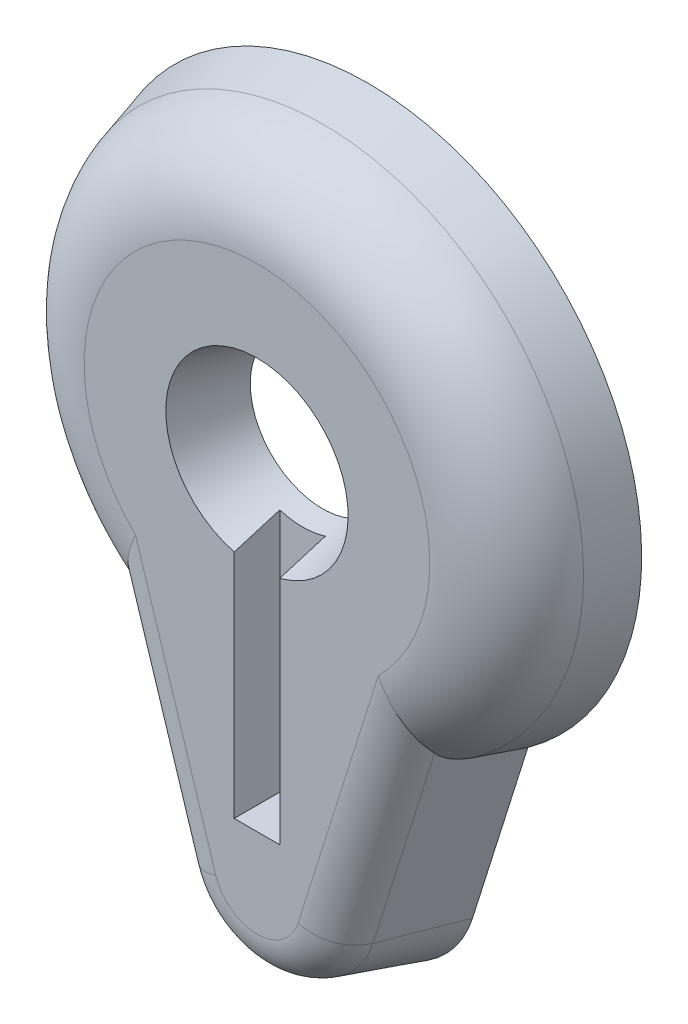
ISO-10303-21;
HEADER;
FILE_DESCRIPTION(('STEP AP214'),'2;1');
FILE_NAME('part.step','',(''),(''),'','','');
FILE_SCHEMA(('AUTOMOTIVE_DESIGN { 1 0 10303 214 1 1 1 1 }'));
ENDSEC;
DATA;
#1=APPLICATION_CONTEXT('core data for automotive mechanical design processes');
#2=APPLICATION_PROTOCOL_DEFINITION('international standard','automotive_design',2000,#1);
#3=PRODUCT_CONTEXT('',#1,'mechanical');
#4=PRODUCT('Part','Part','',(#3));
#5=PRODUCT_RELATED_PRODUCT_CATEGORY('part','',(#4));
#6=PRODUCT_DEFINITION_FORMATION('','',#4);
#7=PRODUCT_DEFINITION_CONTEXT('part definition',#1,'design');
#8=PRODUCT_DEFINITION('design','',#6,#7);
#9=PRODUCT_DEFINITION_SHAPE('','',#8);
#10=(LENGTH_UNIT() NAMED_UNIT(*) SI_UNIT(.MILLI.,.METRE.));
#11=(NAMED_UNIT(*) PLANE_ANGLE_UNIT() SI_UNIT($,.RADIAN.));
#12=(NAMED_UNIT(*) SI_UNIT($,.STERADIAN.) SOLID_ANGLE_UNIT());
#13=UNCERTAINTY_MEASURE_WITH_UNIT(LENGTH_MEASURE(1.E-05),#10,'distance_accuracy_value','');
#14=(GEOMETRIC_REPRESENTATION_CONTEXT(3) GLOBAL_UNCERTAINTY_ASSIGNED_CONTEXT((#13)) GLOBAL_UNIT_ASSIGNED_CONTEXT((#10,
#11,#12)) REPRESENTATION_CONTEXT('',''));
#15=CARTESIAN_POINT('',(0.,0.,0.));
#16=DIRECTION('',(0.,0.,1.));
#17=DIRECTION('',(1.,0.,0.));
#18=AXIS2_PLACEMENT_3D('',#15,#16,#17);
#19=CARTESIAN_POINT('',(0.,0.,0.));
#20=DIRECTION('',(0.,0.,-1.));
#21=DIRECTION('',(1.,0.,0.));
#22=AXIS2_PLACEMENT_3D('',#19,#20,#21);
#23=CONICAL_SURFACE('',#22,15.24,0.279252680319093);
#24=DIRECTION('',(0.262880018502093,-0.082885751454195,-0.961261695938319));
#25=VECTOR('',#24,1.);
#26=CARTESIAN_POINT('',(14.534646329403,-4.58275638444513,0.));
#27=LINE('',#26,#25);
#28=CARTESIAN_POINT('',(11.5553400030557,-3.64338470804834,10.8942972094379));
#29=VERTEX_POINT('',#28);
#30=CARTESIAN_POINT('',(14.534646329403,-4.58275638444513,0.));
#31=VERTEX_POINT('',#30);
#32=EDGE_CURVE('E285',#29,#31,#27,.T.);
#33=ORIENTED_EDGE('',*,*,#32,.F.);
#34=CARTESIAN_POINT('',(0.,0.,10.8942972094379));
#35=DIRECTION('',(0.,0.,-1.));
#36=DIRECTION('',(-1.,0.,0.));
#37=AXIS2_PLACEMENT_3D('',#34,#35,#36);
#38=CIRCLE('',#37,12.1161105441086);
#39=CARTESIAN_POINT('',(-11.5553400030557,-3.64338470804834,10.8942972094379));
#40=VERTEX_POINT('',#39);
#41=EDGE_CURVE('E356',#29,#40,#38,.T.);
#42=ORIENTED_EDGE('',*,*,#41,.T.);
#43=DIRECTION('',(-0.262880018502093,-0.0828857514541949,-0.961261695938319));
#44=VECTOR('',#43,1.);
#45=CARTESIAN_POINT('',(-14.534646329403,-4.58275638444513,0.));
#46=LINE('',#45,#44);
#47=CARTESIAN_POINT('',(-14.534646329403,-4.58275638444513,0.));
#48=VERTEX_POINT('',#47);
#49=EDGE_CURVE('E379',#40,#48,#46,.T.);
#50=ORIENTED_EDGE('',*,*,#49,.T.);
#51=CARTESIAN_POINT('',(0.,0.,0.));
#52=DIRECTION('',(0.,0.,1.));
#53=DIRECTION('',(1.,0.,0.));
#54=AXIS2_PLACEMENT_3D('',#51,#52,#53);
#55=CIRCLE('',#54,15.24);
#56=EDGE_CURVE('E350',#48,#31,#55,.T.);
#57=ORIENTED_EDGE('',*,*,#56,.T.);
#58=EDGE_LOOP('',(#33,#42,#50,#57));
#59=FACE_BOUND('',#58,.T.);
#60=ADVANCED_FACE('F40',(#59),#23,.T.);
#61=CARTESIAN_POINT('',(14.534646329403,-4.58275638444513,0.));
#62=DIRECTION('',(0.916771573521362,-0.289056966809967,0.275637355817));
#63=DIRECTION('',(0.300705799504274,0.953716950748227,0.));
#64=AXIS2_PLACEMENT_3D('',#61,#62,#63);
#65=PLANE('',#64);
#66=CARTESIAN_POINT('',(18.4661043795052,22.6609190085483,15.494));
#67=CARTESIAN_POINT('',(18.7794331227108,22.4238435658306,14.2032489976163));
#68=CARTESIAN_POINT('',(19.0931570385685,22.1879126815013,12.9123839305844));
#69=CARTESIAN_POINT('',(19.7213544121076,21.7182279454823,10.3304438388195));
#70=CARTESIAN_POINT('',(20.0358278677993,21.484474088022,9.03936881465236));
#71=CARTESIAN_POINT('',(20.6654850546608,21.0190301578938,6.45702064732496));
#72=CARTESIAN_POINT('',(20.9806687855488,20.7873400844076,5.1657475042435));
#73=CARTESIAN_POINT('',(21.6117124177187,20.3259238523854,2.58301180073138));
#74=CARTESIAN_POINT('',(21.9275723207909,20.0961976990575,1.29154923980762));
#75=CARTESIAN_POINT('',(22.2437523595632,19.8674042316777,0.));
#76=B_SPLINE_CURVE_WITH_KNOTS('',3,(#66,#67,#68,#69,#70,#71,#72,#73,#74,#75),.UNSPECIFIED.,.F.,
.F.,(4,2,2,2,4),(0.,4.04768493479465,8.09535913744307,12.1430317352329,16.1907150637494),.UNSPECIFIED.);
#77=CARTESIAN_POINT('',(20.7052286654907,20.9901952760398,6.29459441887579));
#78=VERTEX_POINT('',#77);
#79=CARTESIAN_POINT('',(22.2437523595632,19.8674042316777,0.));
#80=VERTEX_POINT('',#79);
#81=EDGE_CURVE('E278',#78,#80,#76,.T.);
#82=ORIENTED_EDGE('',*,*,#81,.F.);
#83=CARTESIAN_POINT('',(20.7052286654917,20.9901952760405,6.29459441887589));
#84=CARTESIAN_POINT('',(20.6522578061883,21.0291060956109,6.51158105095914));
#85=CARTESIAN_POINT('',(20.6026423920615,21.0777707275308,6.72763613535384));
#86=CARTESIAN_POINT('',(20.5104988651825,21.194062310094,7.15605940874421));
#87=CARTESIAN_POINT('',(20.467968840799,21.261684132854,7.36842857829913));
#88=CARTESIAN_POINT('',(20.3914403984128,21.4131947263882,7.78184965765318));
#89=CARTESIAN_POINT('',(20.3572348318264,21.4965697523686,7.98305178809662));
#90=CARTESIAN_POINT('',(20.2960098800669,21.6798445845403,8.37888406605506));
#91=CARTESIAN_POINT('',(20.2689898707987,21.7797429543883,8.5735147830415));
#92=CARTESIAN_POINT('',(20.2217827719205,21.9967438261983,8.95809161155702));
#93=CARTESIAN_POINT('',(20.2017158420014,22.1141031075996,9.14790735213916));
#94=CARTESIAN_POINT('',(20.1689334973503,22.3634378812403,9.51841545970538));
#95=CARTESIAN_POINT('',(20.1562204076856,22.4954179804531,9.6991049247683));
#96=CARTESIAN_POINT('',(20.1376634128668,22.7766255594111,10.0557239863107));
#97=CARTESIAN_POINT('',(20.132035856095,22.9262502462302,10.2313505521116));
#98=CARTESIAN_POINT('',(20.1279900556686,23.2376304085976,10.5713468483465));
#99=CARTESIAN_POINT('',(20.129566063429,23.3993761099778,10.7357254485794));
#100=CARTESIAN_POINT('',(20.1345570886339,23.566415608917,10.8942972094379));
#101=B_SPLINE_CURVE_WITH_KNOTS('',3,(#83,#84,#85,#86,#87,#88,#89,#90,#91,#92,#93,#94,#95,#96,
#97,#98,#99,#100),.UNSPECIFIED.,.F.,.F.,(4,2,2,2,2,2,2,2,4),(0.,0.679935593326594,
1.35968744255824,2.02022828000799,2.68071172802758,3.3520983103277,4.02369704939871,
4.71534086046438,5.40643282268094),.UNSPECIFIED.);
#102=CARTESIAN_POINT('',(20.1345570886339,23.566415608917,10.8942972094379));
#103=VERTEX_POINT('',#102);
#104=EDGE_CURVE('E295',#78,#103,#101,.T.);
#105=ORIENTED_EDGE('',*,*,#104,.T.);
#106=DIRECTION('',(0.300705799504274,0.953716950748227,0.));
#107=VECTOR('',#106,1.);
#108=CARTESIAN_POINT('',(11.5553400030557,-3.64338470804834,10.8942972094379));
#109=LINE('',#108,#107);
#110=EDGE_CURVE('E359',#103,#29,#109,.F.);
#111=ORIENTED_EDGE('',*,*,#110,.T.);
#112=ORIENTED_EDGE('',*,*,#32,.T.);
#113=DIRECTION('',(0.300705799504274,0.953716950748227,0.));
#114=VECTOR('',#113,1.);
#115=CARTESIAN_POINT('',(14.534646329403,-4.58275638444513,0.));
#116=LINE('',#115,#114);
#117=EDGE_CURVE('E393',#31,#80,#116,.T.);
#118=ORIENTED_EDGE('',*,*,#117,.T.);
#119=EDGE_LOOP('',(#82,#105,#111,#112,#118));
#120=FACE_BOUND('',#119,.T.);
#121=ADVANCED_FACE('F265',(#120),#65,.T.);
#122=CARTESIAN_POINT('',(0.,50.8,0.));
#123=DIRECTION('',(0.,0.,-1.));
#124=DIRECTION('',(-1.,0.,0.));
#125=AXIS2_PLACEMENT_3D('',#122,#123,#124);
#126=CONICAL_SURFACE('',#125,38.1,0.279252680319093);
#127=CARTESIAN_POINT('',(-18.4661043795052,22.6609190085483,15.494));
#128=CARTESIAN_POINT('',(-18.7794331227108,22.4238435658306,14.2032489976163));
#129=CARTESIAN_POINT('',(-19.0931570385685,22.1879126815013,12.9123839305844));
#130=CARTESIAN_POINT('',(-19.7213544121076,21.7182279454823,10.3304438388195));
#131=CARTESIAN_POINT('',(-20.0358278677993,21.484474088022,9.03936881465236));
#132=CARTESIAN_POINT('',(-20.6654850546608,21.0190301578938,6.45702064732496));
#133=CARTESIAN_POINT('',(-20.9806687855488,20.7873400844076,5.16574750424351));
#134=CARTESIAN_POINT('',(-21.6117124177187,20.3259238523854,2.58301180073138));
#135=CARTESIAN_POINT('',(-21.9275723207909,20.0961976990576,1.29154923980762));
#136=CARTESIAN_POINT('',(-22.2437523595632,19.8674042316777,0.));
#137=B_SPLINE_CURVE_WITH_KNOTS('',3,(#127,#128,#129,#130,#131,#132,#133,#134,#135,#136),
.UNSPECIFIED.,.F.,.F.,(4,2,2,2,4),(0.,4.04768493479465,8.09535913744307,12.1430317352329,
16.1907150637494),.UNSPECIFIED.);
#138=CARTESIAN_POINT('',(-20.7052286654907,20.9901952760398,6.29459441887579));
#139=VERTEX_POINT('',#138);
#140=CARTESIAN_POINT('',(-22.2437523595632,19.8674042316777,0.));
#141=VERTEX_POINT('',#140);
#142=EDGE_CURVE('E271',#139,#141,#137,.T.);
#143=ORIENTED_EDGE('',*,*,#142,.F.);
#144=CARTESIAN_POINT('',(0.,50.8,6.2945944188759));
#145=DIRECTION('',(0.,0.,-1.));
#146=DIRECTION('',(-1.,0.,0.));
#147=AXIS2_PLACEMENT_3D('',#144,#145,#146);
#148=CIRCLE('',#147,36.2950540951642);
#149=EDGE_CURVE('E338',#139,#78,#148,.T.);
#150=ORIENTED_EDGE('',*,*,#149,.T.);
#151=ORIENTED_EDGE('',*,*,#81,.T.);
#152=CARTESIAN_POINT('',(0.,50.8,0.));
#153=DIRECTION('',(0.,0.,1.));
#154=DIRECTION('',(-1.,0.,0.));
#155=AXIS2_PLACEMENT_3D('',#152,#153,#154);
#156=CIRCLE('',#155,38.1);
#157=EDGE_CURVE('E387',#80,#141,#156,.T.);
#158=ORIENTED_EDGE('',*,*,#157,.T.);
#159=EDGE_LOOP('',(#143,#150,#151,#158));
#160=FACE_BOUND('',#159,.T.);
#161=ADVANCED_FACE('F261',(#160),#126,.T.);
#162=CARTESIAN_POINT('',(-14.534646329403,-4.58275638444513,0.));
#163=DIRECTION('',(-0.916771573521362,-0.289056966809967,0.275637355817));
#164=DIRECTION('',(0.300705799504274,-0.953716950748227,0.));
#165=AXIS2_PLACEMENT_3D('',#162,#163,#164);
#166=PLANE('',#165);
#167=ORIENTED_EDGE('',*,*,#49,.F.);
#168=DIRECTION('',(0.300705799504274,-0.953716950748227,0.));
#169=VECTOR('',#168,1.);
#170=CARTESIAN_POINT('',(-19.7240032012269,22.2643050335271,10.8942972094379));
#171=LINE('',#170,#169);
#172=CARTESIAN_POINT('',(-20.1345570886339,23.566415608917,10.8942972094379));
#173=VERTEX_POINT('',#172);
#174=EDGE_CURVE('E345',#40,#173,#171,.F.);
#175=ORIENTED_EDGE('',*,*,#174,.T.);
#176=CARTESIAN_POINT('',(-20.1345570886339,23.566415608917,10.8942972094379));
#177=CARTESIAN_POINT('',(-20.1296314307962,23.4015427889222,10.737780201637));
#178=CARTESIAN_POINT('',(-20.1280319445707,23.2418275978129,10.5756090581096));
#179=CARTESIAN_POINT('',(-20.1318403396195,22.9341810911119,10.2403178051361));
#180=CARTESIAN_POINT('',(-20.1372534910807,22.7862587268716,10.06718955417));
#181=CARTESIAN_POINT('',(-20.1551904656939,22.507956312942,9.71567928888157));
#182=CARTESIAN_POINT('',(-20.1675065150686,22.3771955711011,9.5375891050103));
#183=CARTESIAN_POINT('',(-20.1993037297183,22.1298741678155,9.1724689388028));
#184=CARTESIAN_POINT('',(-20.2187828785092,22.0133095223094,8.98544148527663));
#185=CARTESIAN_POINT('',(-20.2652229374131,21.7946664165584,8.60169364919496));
#186=CARTESIAN_POINT('',(-20.29225020268,21.6927291635134,8.40490065095984));
#187=CARTESIAN_POINT('',(-20.3536800068785,21.5057626107815,8.00451557776574));
#188=CARTESIAN_POINT('',(-20.3880832856621,21.4207350088694,7.80092282248709));
#189=CARTESIAN_POINT('',(-20.4652174170369,21.2662827050325,7.38240228808909));
#190=CARTESIAN_POINT('',(-20.5081635211387,21.1973907381495,7.1673172527423));
#191=CARTESIAN_POINT('',(-20.6013326451229,21.0790551041956,6.73333926938687));
#192=CARTESIAN_POINT('',(-20.6515576964842,21.0296168808209,6.51444527339331));
#193=CARTESIAN_POINT('',(-20.7052286654907,20.9901952760399,6.29459441887614));
#194=B_SPLINE_CURVE_WITH_KNOTS('',3,(#176,#177,#178,#179,#180,#181,#182,#183,#184,#185,#186,
#187,#188,#189,#190,#191,#192,#193),.UNSPECIFIED.,.F.,.F.,(4,2,2,2,2,2,2,2,4),(0.,
0.682130959493003,1.36477485636077,2.02789690178547,2.69083241445997,3.35978986917565,
4.02881445516272,4.71752509634268,5.40642832101257),.UNSPECIFIED.);
#195=EDGE_CURVE('E305',#173,#139,#194,.T.);
#196=ORIENTED_EDGE('',*,*,#195,.T.);
#197=ORIENTED_EDGE('',*,*,#142,.T.);
#198=DIRECTION('',(0.300705799504274,-0.953716950748227,0.));
#199=VECTOR('',#198,1.);
#200=CARTESIAN_POINT('',(-14.534646329403,-4.58275638444513,0.));
#201=LINE('',#200,#199);
#202=EDGE_CURVE('E377',#141,#48,#201,.T.);
#203=ORIENTED_EDGE('',*,*,#202,.T.);
#204=EDGE_LOOP('',(#167,#175,#196,#197,#203));
#205=FACE_BOUND('',#204,.T.);
#206=ADVANCED_FACE('F255',(#205),#166,.T.);
#207=CARTESIAN_POINT('',(0.,0.,15.494));
#208=DIRECTION('',(0.,0.,1.));
#209=DIRECTION('',(1.,0.,0.));
#210=AXIS2_PLACEMENT_3D('',#207,#208,#209);
#211=PLANE('',#210);
#212=DIRECTION('',(0.,-1.,0.));
#213=VECTOR('',#212,1.);
#214=CARTESIAN_POINT('',(-3.175,57.15,15.494));
#215=LINE('',#214,#213);
#216=CARTESIAN_POINT('',(-3.175,38.5032778757914,15.494));
#217=VERTEX_POINT('',#216);
#218=CARTESIAN_POINT('',(-3.175,6.35,15.494));
#219=VERTEX_POINT('',#218);
#220=EDGE_CURVE('E169',#217,#219,#215,.T.);
#221=ORIENTED_EDGE('',*,*,#220,.F.);
#222=CARTESIAN_POINT('',(0.,50.8,15.494));
#223=DIRECTION('',(0.,0.,1.));
#224=DIRECTION('',(1.,0.,0.));
#225=AXIS2_PLACEMENT_3D('',#222,#223,#224);
#226=CIRCLE('',#225,12.7);
#227=CARTESIAN_POINT('',(3.175,38.5032778757914,15.494));
#228=VERTEX_POINT('',#227);
#229=EDGE_CURVE('E190',#228,#217,#226,.T.);
#230=ORIENTED_EDGE('',*,*,#229,.F.);
#231=DIRECTION('',(0.,1.,0.));
#232=VECTOR('',#231,1.);
#233=CARTESIAN_POINT('',(3.175,57.15,15.494));
#234=LINE('',#233,#232);
#235=CARTESIAN_POINT('',(3.175,6.35,15.494));
#236=VERTEX_POINT('',#235);
#237=EDGE_CURVE('E163',#236,#228,#234,.T.);
#238=ORIENTED_EDGE('',*,*,#237,.F.);
#239=DIRECTION('',(1.,0.,0.));
#240=VECTOR('',#239,1.);
#241=CARTESIAN_POINT('',(-3.175,6.35,15.494));
#242=LINE('',#241,#240);
#243=EDGE_CURVE('E184',#219,#236,#242,.T.);
#244=ORIENTED_EDGE('',*,*,#243,.F.);
#245=EDGE_LOOP('',(#221,#230,#238,#244));
#246=FACE_BOUND('',#245,.T.);
#247=CARTESIAN_POINT('',(0.,50.8,15.494));
#248=DIRECTION('',(0.,0.,1.));
#249=DIRECTION('',(1.,0.,0.));
#250=AXIS2_PLACEMENT_3D('',#247,#248,#249);
#251=CIRCLE('',#250,24.0870305567475);
#252=CARTESIAN_POINT('',(16.9137919179916,33.6504028036641,15.494));
#253=VERTEX_POINT('',#252);
#254=CARTESIAN_POINT('',(-16.9137919179916,33.6504028036641,15.494));
#255=VERTEX_POINT('',#254);
#256=EDGE_CURVE('E341',#253,#255,#251,.T.);
#257=ORIENTED_EDGE('',*,*,#256,.T.);
#258=DIRECTION('',(-0.300705799504274,0.953716950748227,0.));
#259=VECTOR('',#258,1.);
#260=CARTESIAN_POINT('',(-5.73384051119504,-1.80787296880505,15.494));
#261=LINE('',#260,#259);
#262=CARTESIAN_POINT('',(-5.73384051119504,-1.80787296880505,15.494));
#263=VERTEX_POINT('',#262);
#264=EDGE_CURVE('E286',#255,#263,#261,.F.);
#265=ORIENTED_EDGE('',*,*,#264,.T.);
#266=CARTESIAN_POINT('',(0.,0.,15.494));
#267=DIRECTION('',(0.,0.,1.));
#268=DIRECTION('',(1.,0.,0.));
#269=AXIS2_PLACEMENT_3D('',#266,#267,#268);
#270=CIRCLE('',#269,6.01209877490028);
#271=CARTESIAN_POINT('',(5.73384051119504,-1.80787296880505,15.494));
#272=VERTEX_POINT('',#271);
#273=EDGE_CURVE('E364',#263,#272,#270,.T.);
#274=ORIENTED_EDGE('',*,*,#273,.T.);
#275=DIRECTION('',(-0.300705799504274,-0.953716950748227,0.));
#276=VECTOR('',#275,1.);
#277=CARTESIAN_POINT('',(13.9025037093663,24.0998167727704,15.494));
#278=LINE('',#277,#276);
#279=EDGE_CURVE('E362',#272,#253,#278,.F.);
#280=ORIENTED_EDGE('',*,*,#279,.T.);
#281=EDGE_LOOP('',(#257,#265,#274,#280));
#282=FACE_BOUND('',#281,.T.);
#283=ADVANCED_FACE('F251',(#246,#282),#211,.T.);
#284=CARTESIAN_POINT('',(0.,0.,0.));
#285=DIRECTION('',(0.,0.,1.));
#286=DIRECTION('',(1.,0.,0.));
#287=AXIS2_PLACEMENT_3D('',#284,#285,#286);
#288=PLANE('',#287);
#289=DIRECTION('',(-0.300705799504274,0.953716950748227,0.));
#290=VECTOR('',#289,1.);
#291=CARTESIAN_POINT('',(-12.1122052745025,-3.81896365370427,0.));
#292=LINE('',#291,#290);
#293=CARTESIAN_POINT('',(-12.1122052745025,-3.81896365370427,0.));
#294=VERTEX_POINT('',#293);
#295=CARTESIAN_POINT('',(-20.0801252745768,21.4520500041773,0.));
#296=VERTEX_POINT('',#295);
#297=EDGE_CURVE('E198',#294,#296,#292,.T.);
#298=ORIENTED_EDGE('',*,*,#297,.F.);
#299=CARTESIAN_POINT('',(0.,0.,0.));
#300=DIRECTION('',(0.,0.,-1.));
#301=DIRECTION('',(-1.,0.,0.));
#302=AXIS2_PLACEMENT_3D('',#299,#300,#301);
#303=CIRCLE('',#302,12.7);
#304=CARTESIAN_POINT('',(12.1122052745025,-3.81896365370428,0.));
#305=VERTEX_POINT('',#304);
#306=EDGE_CURVE('E71',#305,#294,#303,.T.);
#307=ORIENTED_EDGE('',*,*,#306,.F.);
#308=DIRECTION('',(-0.300705799504275,-0.953716950748226,0.));
#309=VECTOR('',#308,1.);
#310=CARTESIAN_POINT('',(20.0801252745768,21.4520500041773,0.));
#311=LINE('',#310,#309);
#312=CARTESIAN_POINT('',(20.0801252745768,21.4520500041773,0.));
#313=VERTEX_POINT('',#312);
#314=EDGE_CURVE('E206',#313,#305,#311,.T.);
#315=ORIENTED_EDGE('',*,*,#314,.F.);
#316=CARTESIAN_POINT('',(0.,50.8,0.));
#317=DIRECTION('',(0.,0.,-1.));
#318=DIRECTION('',(-1.,0.,0.));
#319=AXIS2_PLACEMENT_3D('',#316,#317,#318);
#320=CIRCLE('',#319,35.5600000000001);
#321=EDGE_CURVE('E202',#296,#313,#320,.T.);
#322=ORIENTED_EDGE('',*,*,#321,.F.);
#323=EDGE_LOOP('',(#298,#307,#315,#322));
#324=FACE_BOUND('',#323,.T.);
#325=ORIENTED_EDGE('',*,*,#56,.F.);
#326=ORIENTED_EDGE('',*,*,#202,.F.);
#327=ORIENTED_EDGE('',*,*,#157,.F.);
#328=ORIENTED_EDGE('',*,*,#117,.F.);
#329=EDGE_LOOP('',(#325,#326,#327,#328));
#330=FACE_BOUND('',#329,.T.);
#331=ADVANCED_FACE('F254',(#324,#330),#288,.F.);
#332=CARTESIAN_POINT('',(-5.73384051119504,-1.80787296880505,9.144));
#333=DIRECTION('',(0.300705799504274,-0.953716950748227,0.));
#334=DIRECTION('',(0.953716950748227,0.300705799504274,0.));
#335=AXIS2_PLACEMENT_3D('',#332,#333,#334);
#336=CYLINDRICAL_SURFACE('',#335,6.35);
#337=ORIENTED_EDGE('',*,*,#264,.F.);
#338=CARTESIAN_POINT('',(-20.1345570886339,23.566415608917,10.8942972094379));
#339=CARTESIAN_POINT('',(-20.1384032714096,23.6954742853626,11.016851885135));
#340=CARTESIAN_POINT('',(-20.1388739971092,23.8258587234298,11.1380809175509));
#341=CARTESIAN_POINT('',(-20.133285541425,24.0892218399771,11.3775170637793));
#342=CARTESIAN_POINT('',(-20.1272267717764,24.2222003543615,11.495724367654));
#343=CARTESIAN_POINT('',(-20.0995984123917,24.6248104881422,11.8451460096048));
#344=CARTESIAN_POINT('',(-20.0685807049351,24.8982660711035,12.0713026510812));
#345=CARTESIAN_POINT('',(-19.9835000813235,25.4537160065136,12.5065716656473));
#346=CARTESIAN_POINT('',(-19.9294985387558,25.7356857738845,12.7157276765479));
#347=CARTESIAN_POINT('',(-19.8007057196387,26.3080812100582,13.1152554057199));
#348=CARTESIAN_POINT('',(-19.7259133914572,26.5985073059304,13.3056261731426));
#349=CARTESIAN_POINT('',(-19.5572708511859,27.1893491371319,13.6669346777524));
#350=CARTESIAN_POINT('',(-19.4632673319502,27.489827859932,13.8376976520778));
#351=CARTESIAN_POINT('',(-19.2592329815304,28.0975191628441,14.1561216908412));
#352=CARTESIAN_POINT('',(-19.1492013714154,28.4047320696063,14.3037816317975));
#353=CARTESIAN_POINT('',(-18.9159116380694,29.0248408433275,14.5744752406447));
#354=CARTESIAN_POINT('',(-18.7926558323574,29.3377357065741,14.6975132127027));
#355=CARTESIAN_POINT('',(-18.5357983232253,29.9682471646074,14.917832783865));
#356=CARTESIAN_POINT('',(-18.4021986629928,30.2858628169476,15.0151194528486));
#357=CARTESIAN_POINT('',(-18.1679498756614,30.8310440508295,15.1584990674512));
#358=CARTESIAN_POINT('',(-18.0691382879588,31.0576793166658,15.2112368853988));
#359=CARTESIAN_POINT('',(-17.8689191603951,31.5125100093339,15.3033157277844));
#360=CARTESIAN_POINT('',(-17.7675118228624,31.7407053135569,15.3426577929693));
#361=CARTESIAN_POINT('',(-17.5633344804011,32.1980448030755,15.4078281927132));
#362=CARTESIAN_POINT('',(-17.4605663880392,32.4271873978428,15.4336737786308));
#363=CARTESIAN_POINT('',(-17.2546720758721,32.8863889037346,15.4719508802788));
#364=CARTESIAN_POINT('',(-17.1515459337418,33.116447617536,15.484385142797));
#365=CARTESIAN_POINT('',(-17.0090470253362,33.4360001511049,15.4924310862819));
#366=CARTESIAN_POINT('',(-16.9693367997418,33.5252299347435,15.4936823914338));
#367=CARTESIAN_POINT('',(-16.924407637668,33.6264688052737,15.4939822810285));
#368=CARTESIAN_POINT('',(-16.9190989181146,33.6384354199373,15.4939999965058));
#369=CARTESIAN_POINT('',(-16.9137919179916,33.6504028036641,15.494));
#370=B_SPLINE_CURVE_WITH_KNOTS('',3,(#338,#339,#340,#341,#342,#343,#344,#345,#346,#347,#348,
#349,#350,#351,#352,#353,#354,#355,#356,#357,#358,#359,#360,#361,#362,#363,#364,#365,#366,#367,
#368,#369),.UNSPECIFIED.,.F.,.F.,(4,2,2,2,2,2,2,2,2,2,2,2,2,2,2,4),(0.,0.533966632503017,
1.06789959623957,2.13514798550739,3.19956421375095,4.26403429171597,5.33735615094179,
6.41073018872605,7.48391642573715,8.55689121797433,9.31494919375718,10.0729482608208,
10.8299760582069,11.5868487784455,11.8798581306485,11.9191320550129),.UNSPECIFIED.);
#371=EDGE_CURVE('E330',#255,#173,#370,.F.);
#372=ORIENTED_EDGE('',*,*,#371,.T.);
#373=ORIENTED_EDGE('',*,*,#174,.F.);
#374=CARTESIAN_POINT('',(-5.73384051119504,-1.80787296880505,9.144));
#375=DIRECTION('',(0.300705799504274,-0.953716950748227,0.));
#376=DIRECTION('',(0.953716950748227,0.300705799504274,0.));
#377=AXIS2_PLACEMENT_3D('',#374,#375,#376);
#378=CIRCLE('',#377,6.35);
#379=EDGE_CURVE('E346',#263,#40,#378,.T.);
#380=ORIENTED_EDGE('',*,*,#379,.F.);
#381=EDGE_LOOP('',(#337,#372,#373,#380));
#382=FACE_BOUND('',#381,.T.);
#383=ADVANCED_FACE('F259',(#382),#336,.T.);
#384=CARTESIAN_POINT('',(0.,0.,9.144));
#385=DIRECTION('',(0.,0.,1.));
#386=DIRECTION('',(1.,0.,0.));
#387=AXIS2_PLACEMENT_3D('',#384,#385,#386);
#388=DEGENERATE_TOROIDAL_SURFACE('',#387,6.01209877490028,6.35,.T.);
#389=ORIENTED_EDGE('',*,*,#379,.T.);
#390=ORIENTED_EDGE('',*,*,#41,.F.);
#391=CARTESIAN_POINT('',(5.73384051119504,-1.80787296880505,9.144));
#392=DIRECTION('',(0.300705799504274,0.953716950748226,0.));
#393=DIRECTION('',(-0.953716950748227,0.300705799504274,0.));
#394=AXIS2_PLACEMENT_3D('',#391,#392,#393);
#395=CIRCLE('',#394,6.35);
#396=EDGE_CURVE('E214',#272,#29,#395,.T.);
#397=ORIENTED_EDGE('',*,*,#396,.F.);
#398=ORIENTED_EDGE('',*,*,#273,.F.);
#399=EDGE_LOOP('',(#389,#390,#397,#398));
#400=FACE_BOUND('',#399,.T.);
#401=ADVANCED_FACE('F323',(#400),#388,.T.);
#402=CARTESIAN_POINT('',(5.73384051119504,-1.80787296880505,9.144));
#403=DIRECTION('',(0.300705799504274,0.953716950748227,0.));
#404=DIRECTION('',(-0.953716950748227,0.300705799504274,0.));
#405=AXIS2_PLACEMENT_3D('',#402,#403,#404);
#406=CYLINDRICAL_SURFACE('',#405,6.35);
#407=ORIENTED_EDGE('',*,*,#396,.T.);
#408=ORIENTED_EDGE('',*,*,#110,.F.);
#409=CARTESIAN_POINT('',(20.1345570886339,23.566415608917,10.8942972094379));
#410=CARTESIAN_POINT('',(20.1384032714096,23.6954742853626,11.016851885135));
#411=CARTESIAN_POINT('',(20.1388739971092,23.8258587234298,11.1380809175509));
#412=CARTESIAN_POINT('',(20.133285541425,24.0892218399771,11.3775170637793));
#413=CARTESIAN_POINT('',(20.1272267717764,24.2222003543615,11.495724367654));
#414=CARTESIAN_POINT('',(20.0995984123917,24.6248104881422,11.8451460096048));
#415=CARTESIAN_POINT('',(20.0685807049351,24.8982660711036,12.0713026510812));
#416=CARTESIAN_POINT('',(19.9835000813235,25.4537160065136,12.5065716656473));
#417=CARTESIAN_POINT('',(19.9294985387558,25.7356857738846,12.7157276765479));
#418=CARTESIAN_POINT('',(19.8007057196387,26.3080812100582,13.1152554057199));
#419=CARTESIAN_POINT('',(19.7259133914572,26.5985073059305,13.3056261731426));
#420=CARTESIAN_POINT('',(19.5572708511859,27.1893491371319,13.6669346777524));
#421=CARTESIAN_POINT('',(19.4632673319502,27.489827859932,13.8376976520778));
#422=CARTESIAN_POINT('',(19.2592329815304,28.0975191628441,14.1561216908412));
#423=CARTESIAN_POINT('',(19.1492013714154,28.4047320696063,14.3037816317975));
#424=CARTESIAN_POINT('',(18.9159116380694,29.0248408433275,14.5744752406447));
#425=CARTESIAN_POINT('',(18.7926558323574,29.3377357065741,14.6975132127028));
#426=CARTESIAN_POINT('',(18.5357983232253,29.9682471646074,14.9178327838651));
#427=CARTESIAN_POINT('',(18.4021986629928,30.2858628169476,15.0151194528486));
#428=CARTESIAN_POINT('',(18.1679498756614,30.8310440508295,15.1584990674512));
#429=CARTESIAN_POINT('',(18.0691382879588,31.0576793166658,15.2112368853988));
#430=CARTESIAN_POINT('',(17.8689191603952,31.5125100093339,15.3033157277844));
#431=CARTESIAN_POINT('',(17.7675118228624,31.7407053135568,15.3426577929693));
#432=CARTESIAN_POINT('',(17.5633344804012,32.1980448030754,15.4078281927132));
#433=CARTESIAN_POINT('',(17.4605663880392,32.4271873978427,15.4336737786308));
#434=CARTESIAN_POINT('',(17.2546720758722,32.8863889037345,15.4719508802788));
#435=CARTESIAN_POINT('',(17.1515459337421,33.1164476175359,15.484385142797));
#436=CARTESIAN_POINT('',(17.0090470253361,33.4360001511047,15.4924310862819));
#437=CARTESIAN_POINT('',(16.9693367997415,33.5252299347433,15.4936823914338));
#438=CARTESIAN_POINT('',(16.9244076376679,33.6264688052737,15.4939822810285));
#439=CARTESIAN_POINT('',(16.9190989181146,33.6384354199373,15.4939999965058));
#440=CARTESIAN_POINT('',(16.9137919179916,33.6504028036641,15.494));
#441=B_SPLINE_CURVE_WITH_KNOTS('',3,(#409,#410,#411,#412,#413,#414,#415,#416,#417,#418,#419,
#420,#421,#422,#423,#424,#425,#426,#427,#428,#429,#430,#431,#432,#433,#434,#435,#436,#437,#438,
#439,#440),.UNSPECIFIED.,.F.,.F.,(4,2,2,2,2,2,2,2,2,2,2,2,2,2,2,4),(0.,0.533966632503035,
1.06789959623961,2.13514798550747,3.199564213751,4.26403429171599,5.33735615094181,
6.41073018872606,7.48391642573718,8.55689121797436,9.31494919375716,10.0729482608207,
10.8299760582068,11.5868487784453,11.8798581306485,11.9191320550129),.UNSPECIFIED.);
#442=EDGE_CURVE('E304',#103,#253,#441,.T.);
#443=ORIENTED_EDGE('',*,*,#442,.T.);
#444=ORIENTED_EDGE('',*,*,#279,.F.);
#445=EDGE_LOOP('',(#407,#408,#443,#444));
#446=FACE_BOUND('',#445,.T.);
#447=ADVANCED_FACE('F319',(#446),#406,.T.);
#448=CARTESIAN_POINT('',(0.,50.8,2.794));
#449=DIRECTION('',(0.,0.,1.));
#450=DIRECTION('',(1.,0.,0.));
#451=AXIS2_PLACEMENT_3D('',#448,#449,#450);
#452=TOROIDAL_SURFACE('',#451,24.0870305567475,12.7);
#453=ORIENTED_EDGE('',*,*,#104,.F.);
#454=ORIENTED_EDGE('',*,*,#149,.F.);
#455=ORIENTED_EDGE('',*,*,#195,.F.);
#456=ORIENTED_EDGE('',*,*,#371,.F.);
#457=ORIENTED_EDGE('',*,*,#256,.F.);
#458=ORIENTED_EDGE('',*,*,#442,.F.);
#459=EDGE_LOOP('',(#453,#454,#455,#456,#457,#458));
#460=FACE_BOUND('',#459,.T.);
#461=ADVANCED_FACE('F42',(#460),#452,.T.);
#462=CARTESIAN_POINT('',(0.,0.,0.));
#463=DIRECTION('',(0.,0.,-1.));
#464=DIRECTION('',(-1.,0.,0.));
#465=AXIS2_PLACEMENT_3D('',#462,#463,#464);
#466=CONICAL_SURFACE('',#465,12.7,0.279252680319093);
#467=ORIENTED_EDGE('',*,*,#306,.T.);
#468=DIRECTION('',(-0.262880018502093,-0.0828857514541949,-0.961261695938319));
#469=VECTOR('',#468,1.);
#470=CARTESIAN_POINT('',(-12.1122052745025,-3.81896365370428,0.));
#471=LINE('',#470,#469);
#472=CARTESIAN_POINT('',(-10.3756457875889,-3.27142855066413,6.35));
#473=VERTEX_POINT('',#472);
#474=EDGE_CURVE('E216',#473,#294,#471,.T.);
#475=ORIENTED_EDGE('',*,*,#474,.F.);
#476=CARTESIAN_POINT('',(0.,0.,6.35));
#477=DIRECTION('',(0.,0.,-1.));
#478=DIRECTION('',(-1.,0.,0.));
#479=AXIS2_PLACEMENT_3D('',#476,#477,#478);
#480=CIRCLE('',#479,10.8791668004316);
#481=CARTESIAN_POINT('',(10.3756457875889,-3.27142855066412,6.35));
#482=VERTEX_POINT('',#481);
#483=EDGE_CURVE('E210',#482,#473,#480,.T.);
#484=ORIENTED_EDGE('',*,*,#483,.F.);
#485=DIRECTION('',(0.262880018502093,-0.0828857514541952,-0.961261695938319));
#486=VECTOR('',#485,1.);
#487=CARTESIAN_POINT('',(12.1122052745025,-3.81896365370428,0.));
#488=LINE('',#487,#486);
#489=EDGE_CURVE('E211',#482,#305,#488,.T.);
#490=ORIENTED_EDGE('',*,*,#489,.T.);
#491=EDGE_LOOP('',(#467,#475,#484,#490));
#492=FACE_BOUND('',#491,.T.);
#493=ADVANCED_FACE('F247',(#492),#466,.F.);
#494=CARTESIAN_POINT('',(20.0801252745768,21.4520500041773,0.));
#495=DIRECTION('',(0.916771573521362,-0.289056966809967,0.275637355817));
#496=DIRECTION('',(0.300705799504275,0.953716950748226,0.));
#497=AXIS2_PLACEMENT_3D('',#494,#495,#496);
#498=PLANE('',#497);
#499=ORIENTED_EDGE('',*,*,#314,.T.);
#500=ORIENTED_EDGE('',*,*,#489,.F.);
#501=DIRECTION('',(-0.300705799504275,-0.953716950748226,0.));
#502=VECTOR('',#501,1.);
#503=CARTESIAN_POINT('',(10.3756457875889,-3.27142855066413,6.35));
#504=LINE('',#503,#502);
#505=CARTESIAN_POINT('',(18.5355286076805,22.6084133894311,6.35));
#506=VERTEX_POINT('',#505);
#507=EDGE_CURVE('E220',#506,#482,#504,.T.);
#508=ORIENTED_EDGE('',*,*,#507,.F.);
#509=CARTESIAN_POINT('',(18.5355286076805,22.6084133894311,6.35));
#510=CARTESIAN_POINT('',(18.792454197893,22.414215319415,5.29181112777095));
#511=CARTESIAN_POINT('',(19.049633383598,22.2207526677156,4.23355001805187));
#512=CARTESIAN_POINT('',(19.5644989392434,21.8352982060029,2.11688335138142));
#513=CARTESIAN_POINT('',(19.8221853091705,21.6433063959511,1.05847779443383));
#514=CARTESIAN_POINT('',(20.0801252745768,21.4520500041773,0.));
#515=B_SPLINE_CURVE_WITH_KNOTS('',3,(#509,#510,#511,#512,#513,#514),.UNSPECIFIED.,.F.,.F.,(4,2,
4),(0.,3.31833837448153,6.63667666196167),.UNSPECIFIED.);
#516=EDGE_CURVE('E215',#506,#313,#515,.T.);
#517=ORIENTED_EDGE('',*,*,#516,.T.);
#518=EDGE_LOOP('',(#499,#500,#508,#517));
#519=FACE_BOUND('',#518,.T.);
#520=ADVANCED_FACE('F243',(#519),#498,.F.);
#521=CARTESIAN_POINT('',(0.,50.8,0.));
#522=DIRECTION('',(0.,0.,-1.));
#523=DIRECTION('',(-1.,0.,0.));
#524=AXIS2_PLACEMENT_3D('',#521,#522,#523);
#525=CONICAL_SURFACE('',#524,35.5600000000001,0.279252680319093);
#526=ORIENTED_EDGE('',*,*,#321,.T.);
#527=ORIENTED_EDGE('',*,*,#516,.F.);
#528=CARTESIAN_POINT('',(0.,50.8,6.35));
#529=DIRECTION('',(0.,0.,-1.));
#530=DIRECTION('',(-1.,0.,0.));
#531=AXIS2_PLACEMENT_3D('',#528,#529,#530);
#532=CIRCLE('',#531,33.7391668004317);
#533=CARTESIAN_POINT('',(-18.5355286076805,22.6084133894311,6.35));
#534=VERTEX_POINT('',#533);
#535=EDGE_CURVE('E405',#534,#506,#532,.T.);
#536=ORIENTED_EDGE('',*,*,#535,.F.);
#537=CARTESIAN_POINT('',(-18.5355286076805,22.6084133894311,6.35));
#538=CARTESIAN_POINT('',(-18.792454197893,22.414215319415,5.29181112777095));
#539=CARTESIAN_POINT('',(-19.0496333835979,22.2207526677156,4.23355001805187));
#540=CARTESIAN_POINT('',(-19.5644989392433,21.8352982060029,2.11688335138142));
#541=CARTESIAN_POINT('',(-19.8221853091705,21.643306395951,1.05847779443383));
#542=CARTESIAN_POINT('',(-20.0801252745768,21.4520500041773,0.));
#543=B_SPLINE_CURVE_WITH_KNOTS('',3,(#537,#538,#539,#540,#541,#542),.UNSPECIFIED.,.F.,.F.,(4,2,
4),(0.,3.31833837448153,6.63667666196167),.UNSPECIFIED.);
#544=EDGE_CURVE('E219',#534,#296,#543,.T.);
#545=ORIENTED_EDGE('',*,*,#544,.T.);
#546=EDGE_LOOP('',(#526,#527,#536,#545));
#547=FACE_BOUND('',#546,.T.);
#548=ADVANCED_FACE('F235',(#547),#525,.F.);
#549=CARTESIAN_POINT('',(-12.1122052745025,-3.81896365370427,0.));
#550=DIRECTION('',(-0.916771573521362,-0.289056966809967,0.275637355817));
#551=DIRECTION('',(0.300705799504274,-0.953716950748227,0.));
#552=AXIS2_PLACEMENT_3D('',#549,#550,#551);
#553=PLANE('',#552);
#554=ORIENTED_EDGE('',*,*,#297,.T.);
#555=ORIENTED_EDGE('',*,*,#544,.F.);
#556=DIRECTION('',(-0.300705799504274,0.953716950748227,0.));
#557=VECTOR('',#556,1.);
#558=CARTESIAN_POINT('',(-10.3756457875889,-3.27142855066413,6.35));
#559=LINE('',#558,#557);
#560=EDGE_CURVE('E401',#473,#534,#559,.T.);
#561=ORIENTED_EDGE('',*,*,#560,.F.);
#562=ORIENTED_EDGE('',*,*,#474,.T.);
#563=EDGE_LOOP('',(#554,#555,#561,#562));
#564=FACE_BOUND('',#563,.T.);
#565=ADVANCED_FACE('F238',(#564),#553,.F.);
#566=CARTESIAN_POINT('',(0.,0.,6.35));
#567=DIRECTION('',(0.,0.,-1.));
#568=DIRECTION('',(-1.,0.,0.));
#569=AXIS2_PLACEMENT_3D('',#566,#567,#568);
#570=PLANE('',#569);
#571=CARTESIAN_POINT('',(0.,50.8,6.35));
#572=DIRECTION('',(0.,0.,-1.));
#573=DIRECTION('',(-1.,0.,0.));
#574=AXIS2_PLACEMENT_3D('',#571,#572,#573);
#575=CIRCLE('',#574,10.0780001926215);
#576=CARTESIAN_POINT('',(-10.0780001926215,50.8,6.35));
#577=VERTEX_POINT('',#576);
#578=EDGE_CURVE('E195',#577,#577,#575,.T.);
#579=ORIENTED_EDGE('',*,*,#578,.F.);
#580=EDGE_LOOP('',(#579));
#581=FACE_BOUND('',#580,.T.);
#582=ORIENTED_EDGE('',*,*,#483,.T.);
#583=ORIENTED_EDGE('',*,*,#560,.T.);
#584=ORIENTED_EDGE('',*,*,#535,.T.);
#585=ORIENTED_EDGE('',*,*,#507,.T.);
#586=EDGE_LOOP('',(#582,#583,#584,#585));
#587=FACE_BOUND('',#586,.T.);
#588=ADVANCED_FACE('F241',(#581,#587),#570,.T.);
#589=CARTESIAN_POINT('',(0.,50.8,15.494));
#590=DIRECTION('',(0.,0.,1.));
#591=DIRECTION('',(1.,0.,0.));
#592=AXIS2_PLACEMENT_3D('',#589,#590,#591);
#593=CONICAL_SURFACE('',#592,12.7,0.279252680319093);
#594=ORIENTED_EDGE('',*,*,#229,.T.);
#595=CARTESIAN_POINT('',(-3.175,32.6170815512688,35.5746631420692));
#596=CARTESIAN_POINT('',(-3.175,32.954119180155,34.4167988592083));
#597=CARTESIAN_POINT('',(-3.175,33.2914079782165,33.2590077386891));
#598=CARTESIAN_POINT('',(-3.175,33.9665944414658,30.943602834198));
#599=CARTESIAN_POINT('',(-3.175,34.3044921067617,29.7859890502576));
#600=CARTESIAN_POINT('',(-3.175,35.3192458893536,26.3135023389367));
#601=CARTESIAN_POINT('',(-3.175,35.9971748698086,23.9989425359517));
#602=CARTESIAN_POINT('',(-3.175,37.0172327714592,20.5282331848742));
#603=CARTESIAN_POINT('',(-3.175,37.3577522066865,19.3716106148441));
#604=CARTESIAN_POINT('',(-3.175,38.0401454749378,17.0587651630902));
#605=CARTESIAN_POINT('',(-3.175,38.382019307697,15.9025422812884));
#606=CARTESIAN_POINT('',(-3.175,39.0674964158789,13.5905824027804));
#607=CARTESIAN_POINT('',(-3.175,39.4110997278682,12.4348454169122));
#608=CARTESIAN_POINT('',(-3.175,40.1005475314021,10.1240388053651));
#609=CARTESIAN_POINT('',(-3.175,40.4463920241958,8.96896918005852));
#610=CARTESIAN_POINT('',(-3.175,41.030020230587,7.02894443471327));
#611=CARTESIAN_POINT('',(-3.175,41.2669952235915,6.24374608372987));
#612=CARTESIAN_POINT('',(-3.175,41.7426825920679,4.67387791392072));
#613=CARTESIAN_POINT('',(-3.175,41.9813949625911,3.88920809359646));
#614=CARTESIAN_POINT('',(-3.175,42.4610079068148,2.32058021054019));
#615=CARTESIAN_POINT('',(-3.175,42.7019083696909,1.53662211394809));
#616=CARTESIAN_POINT('',(-3.175,43.1865605817636,-0.0304220600118914));
#617=CARTESIAN_POINT('',(-3.175,43.4303123595043,-0.81350812856393));
#618=CARTESIAN_POINT('',(-3.175,43.921654606282,-2.37862470074093));
#619=CARTESIAN_POINT('',(-3.175,44.1692457300075,-3.16065499906139));
#620=CARTESIAN_POINT('',(-3.175,44.6696362818415,-4.72303082135092));
#621=CARTESIAN_POINT('',(-3.175,44.9224355670305,-5.50337639090389));
#622=CARTESIAN_POINT('',(-3.175,45.3073379209716,-6.67209151317033));
#623=CARTESIAN_POINT('',(-3.175,45.4366006337074,-7.06139607024657));
#624=CARTESIAN_POINT('',(-3.175,45.6974754130084,-7.8392138826639));
#625=CARTESIAN_POINT('',(-3.175,45.8290874559264,-8.22772714592596));
#626=CARTESIAN_POINT('',(-3.175,46.0952602413119,-9.00378530609075));
#627=CARTESIAN_POINT('',(-3.175,46.2298212550459,-9.39133011022414));
#628=CARTESIAN_POINT('',(-3.175,46.4344951669646,-9.97165581710393));
#629=CARTESIAN_POINT('',(-3.175,46.5031930796056,-10.1649357968117));
#630=CARTESIAN_POINT('',(-3.175,46.6416791676126,-10.5511064219494));
#631=CARTESIAN_POINT('',(-3.175,46.7114673520102,-10.7439970641391));
#632=CARTESIAN_POINT('',(-3.175,46.7818735308185,-10.9366631420689));
#633=B_SPLINE_CURVE_WITH_KNOTS('',3,(#595,#596,#597,#598,#599,#600,#601,#602,#603,#604,#605,
#606,#607,#608,#609,#610,#611,#612,#613,#614,#615,#616,#617,#618,#619,#620,#621,#622,#623,#624,
#625,#626,#627,#628,#629,#630,#631,#632),.UNSPECIFIED.,.F.,.F.,(4,2,2,2,2,2,2,2,2,2,2,2,2,2,2,2,
2,2,4),(0.,3.61776110516794,7.23552285264681,14.4709166370222,18.088036899975,21.7051564556173,
25.3223528123523,28.9395511855409,31.4000866715656,33.8606151517385,36.3210196963238,
38.7814488927656,41.2423023607623,43.7030883890585,44.9336929948104,46.1642852208949,
47.394991124441,48.0103653183149,48.6257446125237),.UNSPECIFIED.);
#634=CARTESIAN_POINT('',(-3.175,40.3944416165391,9.144));
#635=VERTEX_POINT('',#634);
#636=EDGE_CURVE('E11',#217,#635,#633,.T.);
#637=ORIENTED_EDGE('',*,*,#636,.T.);
#638=CARTESIAN_POINT('',(0.,50.8,9.144));
#639=DIRECTION('',(0.,0.,1.));
#640=DIRECTION('',(1.,0.,0.));
#641=AXIS2_PLACEMENT_3D('',#638,#639,#640);
#642=CIRCLE('',#641,10.8791668004316);
#643=CARTESIAN_POINT('',(3.175,40.3944416165391,9.144));
#644=VERTEX_POINT('',#643);
#645=EDGE_CURVE('E160',#644,#635,#642,.F.);
#646=ORIENTED_EDGE('',*,*,#645,.F.);
#647=CARTESIAN_POINT('',(3.175,46.7818735308186,-10.9366631420692));
#648=CARTESIAN_POINT('',(3.175,46.6670072318796,-10.6222507571409));
#649=CARTESIAN_POINT('',(3.175,46.5537444754467,-10.3072585349179));
#650=CARTESIAN_POINT('',(3.175,46.3298923227185,-9.6763331525888));
#651=CARTESIAN_POINT('',(3.175,46.2193028630194,-9.36040001499878));
#652=CARTESIAN_POINT('',(3.175,46.0002670235396,-8.72782214218542));
#653=CARTESIAN_POINT('',(3.175,45.8918204713522,-8.41117746651022));
#654=CARTESIAN_POINT('',(3.175,45.6766990828966,-7.77728499200134));
#655=CARTESIAN_POINT('',(3.175,45.5700242588781,-7.46003718901457));
#656=CARTESIAN_POINT('',(3.175,45.2522398252231,-6.50766105461888));
#657=CARTESIAN_POINT('',(3.175,45.043334889608,-5.87179719441667));
#658=CARTESIAN_POINT('',(3.175,44.6297659365711,-4.59867864537206));
#659=CARTESIAN_POINT('',(3.175,44.4251020284031,-3.9614239211657));
#660=CARTESIAN_POINT('',(3.175,44.019031567828,-2.68607752428251));
#661=CARTESIAN_POINT('',(3.175,43.8176241084396,-2.04798614008688));
#662=CARTESIAN_POINT('',(3.175,43.4172867429432,-0.77102610438399));
#663=CARTESIAN_POINT('',(3.175,43.2183568424802,-0.132157451109395));
#664=CARTESIAN_POINT('',(3.175,42.6244737760493,1.78535955500627));
#665=CARTESIAN_POINT('',(3.175,42.232430466369,3.0649087722744));
#666=CARTESIAN_POINT('',(3.175,41.4534259854963,5.62557274369037));
#667=CARTESIAN_POINT('',(3.175,41.0664649017228,6.9066875243541));
#668=CARTESIAN_POINT('',(3.175,40.296118885355,9.46998439286176));
#669=CARTESIAN_POINT('',(3.175,39.9127339355484,10.7521664755363));
#670=CARTESIAN_POINT('',(3.175,39.1484814776491,13.317566892738));
#671=CARTESIAN_POINT('',(3.175,38.7676145031193,14.6007853860755));
#672=CARTESIAN_POINT('',(3.175,38.007837778709,17.1678029660597));
#673=CARTESIAN_POINT('',(3.175,37.6289280310677,18.4516020533688));
#674=CARTESIAN_POINT('',(3.175,36.4944439983784,22.3036250041796));
#675=CARTESIAN_POINT('',(3.175,35.7411052225921,24.8725072152718));
#676=CARTESIAN_POINT('',(3.175,34.7914473079646,28.1195647954594));
#677=CARTESIAN_POINT('',(3.175,34.5933922518716,28.7972335372897));
#678=CARTESIAN_POINT('',(3.175,34.1975215235522,30.152642317652));
#679=CARTESIAN_POINT('',(3.175,33.9997058517629,30.8303823563116));
#680=CARTESIAN_POINT('',(3.175,33.6043106104339,32.1858473958702));
#681=CARTESIAN_POINT('',(3.175,33.4067310165349,32.8635723896652));
#682=CARTESIAN_POINT('',(3.175,33.0117658359413,34.2190775394063));
#683=CARTESIAN_POINT('',(3.175,32.8143802488864,34.8968576952475));
#684=CARTESIAN_POINT('',(3.175,32.6170815512688,35.5746631420692));
#685=B_SPLINE_CURVE_WITH_KNOTS('',3,(#647,#648,#649,#650,#651,#652,#653,#654,#655,#656,#657,
#658,#659,#660,#661,#662,#663,#664,#665,#666,#667,#668,#669,#670,#671,#672,#673,#674,#675,#676,
#677,#678,#679,#680,#681,#682,#683,#684),.UNSPECIFIED.,.F.,.F.,(4,2,2,2,2,2,2,2,2,2,2,2,2,2,2,2,
2,2,4),(0.,1.00420101781125,2.00837819512517,3.01247425014549,4.01657724454041,6.02445709988805,
8.03238861636466,10.0397509031754,12.0471177628361,16.0618835194137,20.076718243443,
24.0915336335945,28.1071741253556,32.1228192101216,40.1540071727993,42.2720597600498,
44.3901162097704,46.5079310420429,48.6257419329572),.UNSPECIFIED.);
#686=EDGE_CURVE('E56',#644,#228,#685,.T.);
#687=ORIENTED_EDGE('',*,*,#686,.T.);
#688=EDGE_LOOP('',(#594,#637,#646,#687));
#689=FACE_BOUND('',#688,.T.);
#690=ORIENTED_EDGE('',*,*,#578,.T.);
#691=EDGE_LOOP('',(#690));
#692=FACE_BOUND('',#691,.T.);
#693=ADVANCED_FACE('F445',(#689,#692),#593,.F.);
#694=CARTESIAN_POINT('',(-3.175,57.15,9.144));
#695=DIRECTION('',(-1.,0.,0.));
#696=DIRECTION('',(0.,0.,1.));
#697=AXIS2_PLACEMENT_3D('',#694,#695,#696);
#698=PLANE('',#697);
#699=ORIENTED_EDGE('',*,*,#220,.T.);
#700=DIRECTION('',(0.,0.,1.));
#701=VECTOR('',#700,1.);
#702=CARTESIAN_POINT('',(-3.175,6.35,9.144));
#703=LINE('',#702,#701);
#704=CARTESIAN_POINT('',(-3.175,6.35,9.144));
#705=VERTEX_POINT('',#704);
#706=EDGE_CURVE('E166',#705,#219,#703,.T.);
#707=ORIENTED_EDGE('',*,*,#706,.F.);
#708=DIRECTION('',(0.,-1.,0.));
#709=VECTOR('',#708,1.);
#710=CARTESIAN_POINT('',(-3.175,57.15,9.144));
#711=LINE('',#710,#709);
#712=EDGE_CURVE('E154',#635,#705,#711,.T.);
#713=ORIENTED_EDGE('',*,*,#712,.F.);
#714=ORIENTED_EDGE('',*,*,#636,.F.);
#715=EDGE_LOOP('',(#699,#707,#713,#714));
#716=FACE_BOUND('',#715,.T.);
#717=ADVANCED_FACE('F167',(#716),#698,.F.);
#718=CARTESIAN_POINT('',(3.175,57.15,9.144));
#719=DIRECTION('',(1.,0.,0.));
#720=DIRECTION('',(0.,0.,-1.));
#721=AXIS2_PLACEMENT_3D('',#718,#719,#720);
#722=PLANE('',#721);
#723=DIRECTION('',(0.,1.,0.));
#724=VECTOR('',#723,1.);
#725=CARTESIAN_POINT('',(3.175,57.15,9.144));
#726=LINE('',#725,#724);
#727=CARTESIAN_POINT('',(3.175,6.35,9.144));
#728=VERTEX_POINT('',#727);
#729=EDGE_CURVE('E63',#728,#644,#726,.T.);
#730=ORIENTED_EDGE('',*,*,#729,.F.);
#731=DIRECTION('',(0.,0.,1.));
#732=VECTOR('',#731,1.);
#733=CARTESIAN_POINT('',(3.175,6.35,9.144));
#734=LINE('',#733,#732);
#735=EDGE_CURVE('E174',#728,#236,#734,.T.);
#736=ORIENTED_EDGE('',*,*,#735,.T.);
#737=ORIENTED_EDGE('',*,*,#237,.T.);
#738=ORIENTED_EDGE('',*,*,#686,.F.);
#739=EDGE_LOOP('',(#730,#736,#737,#738));
#740=FACE_BOUND('',#739,.T.);
#741=ADVANCED_FACE('F447',(#740),#722,.F.);
#742=CARTESIAN_POINT('',(0.,0.,9.144));
#743=DIRECTION('',(0.,0.,1.));
#744=DIRECTION('',(1.,0.,0.));
#745=AXIS2_PLACEMENT_3D('',#742,#743,#744);
#746=PLANE('',#745);
#747=ORIENTED_EDGE('',*,*,#645,.T.);
#748=ORIENTED_EDGE('',*,*,#712,.T.);
#749=DIRECTION('',(1.,0.,0.));
#750=VECTOR('',#749,1.);
#751=CARTESIAN_POINT('',(-3.175,6.35,9.144));
#752=LINE('',#751,#750);
#753=EDGE_CURVE('E158',#705,#728,#752,.T.);
#754=ORIENTED_EDGE('',*,*,#753,.T.);
#755=ORIENTED_EDGE('',*,*,#729,.T.);
#756=EDGE_LOOP('',(#747,#748,#754,#755));
#757=FACE_BOUND('',#756,.T.);
#758=ADVANCED_FACE('F156',(#757),#746,.T.);
#759=CARTESIAN_POINT('',(-3.175,6.35,9.144));
#760=DIRECTION('',(0.,-1.,0.));
#761=DIRECTION('',(0.,0.,-1.));
#762=AXIS2_PLACEMENT_3D('',#759,#760,#761);
#763=PLANE('',#762);
#764=ORIENTED_EDGE('',*,*,#243,.T.);
#765=ORIENTED_EDGE('',*,*,#735,.F.);
#766=ORIENTED_EDGE('',*,*,#753,.F.);
#767=ORIENTED_EDGE('',*,*,#706,.T.);
#768=EDGE_LOOP('',(#764,#765,#766,#767));
#769=FACE_BOUND('',#768,.T.);
#770=ADVANCED_FACE('F176',(#769),#763,.F.);
#771=CLOSED_SHELL('',(#60,#121,#161,#206,#283,#331,#383,#401,#447,#461,#493,#520,#548,#565,#588,
#693,#717,#741,#758,#770));
#772=MANIFOLD_SOLID_BREP('B2',#771);
#773=ADVANCED_BREP_SHAPE_REPRESENTATION('',(#18,#772),#14);
#774=SHAPE_DEFINITION_REPRESENTATION(#9,#773);
ENDSEC;
END-ISO-10303-21;
